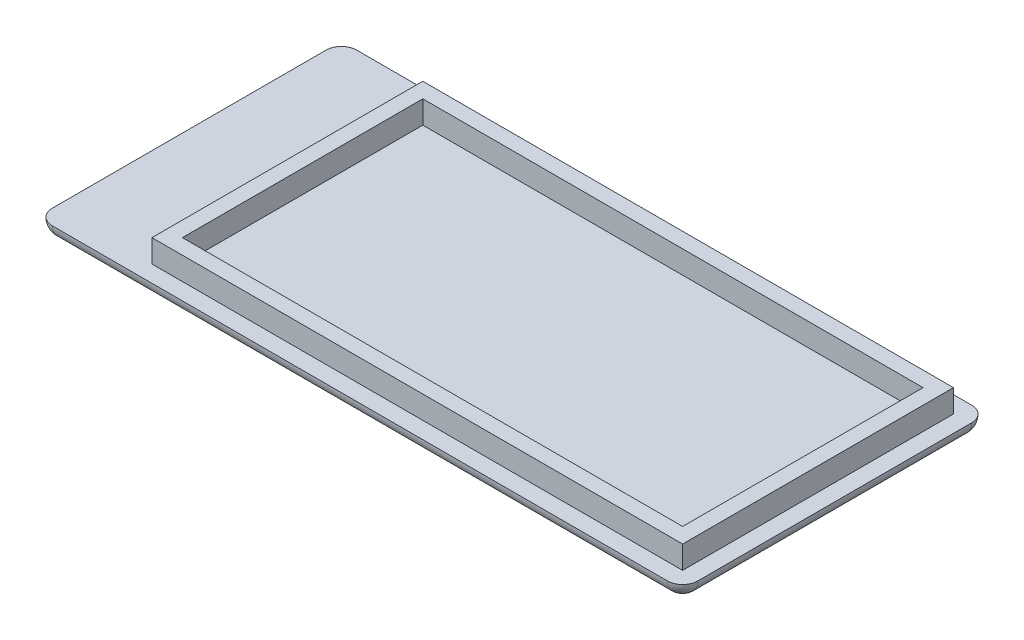
ISO-10303-21;
HEADER;
FILE_DESCRIPTION(('STEP AP214'),'2;1');
FILE_NAME('part.step','',(''),(''),'','','');
FILE_SCHEMA(('AUTOMOTIVE_DESIGN { 1 0 10303 214 1 1 1 1 }'));
ENDSEC;
DATA;
#1=APPLICATION_CONTEXT('core data for automotive mechanical design processes');
#2=APPLICATION_PROTOCOL_DEFINITION('international standard','automotive_design',2000,#1);
#3=PRODUCT_CONTEXT('',#1,'mechanical');
#4=PRODUCT('Part','Part','',(#3));
#5=PRODUCT_RELATED_PRODUCT_CATEGORY('part','',(#4));
#6=PRODUCT_DEFINITION_FORMATION('','',#4);
#7=PRODUCT_DEFINITION_CONTEXT('part definition',#1,'design');
#8=PRODUCT_DEFINITION('design','',#6,#7);
#9=PRODUCT_DEFINITION_SHAPE('','',#8);
#10=(LENGTH_UNIT() NAMED_UNIT(*) SI_UNIT(.MILLI.,.METRE.));
#11=(NAMED_UNIT(*) PLANE_ANGLE_UNIT() SI_UNIT($,.RADIAN.));
#12=(NAMED_UNIT(*) SI_UNIT($,.STERADIAN.) SOLID_ANGLE_UNIT());
#13=UNCERTAINTY_MEASURE_WITH_UNIT(LENGTH_MEASURE(1.E-05),#10,'distance_accuracy_value','');
#14=(GEOMETRIC_REPRESENTATION_CONTEXT(3) GLOBAL_UNCERTAINTY_ASSIGNED_CONTEXT((#13)) GLOBAL_UNIT_ASSIGNED_CONTEXT((#10,
#11,#12)) REPRESENTATION_CONTEXT('',''));
#15=CARTESIAN_POINT('',(0.,0.,0.));
#16=DIRECTION('',(0.,0.,1.));
#17=DIRECTION('',(1.,0.,0.));
#18=AXIS2_PLACEMENT_3D('',#15,#16,#17);
#19=CARTESIAN_POINT('',(0.,1.,19.99996));
#20=DIRECTION('',(0.,-1.,0.));
#21=DIRECTION('',(0.,0.,-1.));
#22=AXIS2_PLACEMENT_3D('',#19,#20,#21);
#23=PLANE('',#22);
#24=DIRECTION('',(-1.,0.,0.));
#25=VECTOR('',#24,1.);
#26=CARTESIAN_POINT('',(0.,1.,19.99996));
#27=LINE('',#26,#25);
#28=CARTESIAN_POINT('',(41.42562,1.,19.99996));
#29=VERTEX_POINT('',#28);
#30=CARTESIAN_POINT('',(1.,1.,19.99996));
#31=VERTEX_POINT('',#30);
#32=EDGE_CURVE('E205',#29,#31,#27,.T.);
#33=ORIENTED_EDGE('',*,*,#32,.F.);
#34=CARTESIAN_POINT('',(41.42562,1.,18.99996));
#35=DIRECTION('',(0.,-1.,0.));
#36=DIRECTION('',(0.,0.,-1.));
#37=AXIS2_PLACEMENT_3D('',#34,#35,#36);
#38=CIRCLE('',#37,1.);
#39=CARTESIAN_POINT('',(42.42562,1.,18.99996));
#40=VERTEX_POINT('',#39);
#41=EDGE_CURVE('E221',#29,#40,#38,.F.);
#42=ORIENTED_EDGE('',*,*,#41,.T.);
#43=DIRECTION('',(0.,0.,-1.));
#44=VECTOR('',#43,1.);
#45=CARTESIAN_POINT('',(42.42562,1.,19.99996));
#46=LINE('',#45,#44);
#47=CARTESIAN_POINT('',(42.42562,1.,1.));
#48=VERTEX_POINT('',#47);
#49=EDGE_CURVE('E213',#40,#48,#46,.T.);
#50=ORIENTED_EDGE('',*,*,#49,.T.);
#51=CARTESIAN_POINT('',(41.42562,1.,1.));
#52=DIRECTION('',(0.,-1.,0.));
#53=DIRECTION('',(0.,0.,-1.));
#54=AXIS2_PLACEMENT_3D('',#51,#52,#53);
#55=CIRCLE('',#54,1.);
#56=CARTESIAN_POINT('',(41.42562,1.,0.));
#57=VERTEX_POINT('',#56);
#58=EDGE_CURVE('E219',#48,#57,#55,.F.);
#59=ORIENTED_EDGE('',*,*,#58,.T.);
#60=DIRECTION('',(-1.,0.,0.));
#61=VECTOR('',#60,1.);
#62=CARTESIAN_POINT('',(0.,1.,0.));
#63=LINE('',#62,#61);
#64=CARTESIAN_POINT('',(1.,1.,0.));
#65=VERTEX_POINT('',#64);
#66=EDGE_CURVE('E209',#57,#65,#63,.T.);
#67=ORIENTED_EDGE('',*,*,#66,.T.);
#68=CARTESIAN_POINT('',(1.,1.,1.));
#69=DIRECTION('',(0.,-1.,0.));
#70=DIRECTION('',(0.,0.,-1.));
#71=AXIS2_PLACEMENT_3D('',#68,#69,#70);
#72=CIRCLE('',#71,1.);
#73=CARTESIAN_POINT('',(0.,1.,1.));
#74=VERTEX_POINT('',#73);
#75=EDGE_CURVE('E217',#65,#74,#72,.F.);
#76=ORIENTED_EDGE('',*,*,#75,.T.);
#77=DIRECTION('',(0.,0.,-1.));
#78=VECTOR('',#77,1.);
#79=CARTESIAN_POINT('',(0.,1.,19.99996));
#80=LINE('',#79,#78);
#81=CARTESIAN_POINT('',(0.,1.,18.99996));
#82=VERTEX_POINT('',#81);
#83=EDGE_CURVE('E208',#82,#74,#80,.T.);
#84=ORIENTED_EDGE('',*,*,#83,.F.);
#85=CARTESIAN_POINT('',(1.,1.,18.99996));
#86=DIRECTION('',(0.,-1.,0.));
#87=DIRECTION('',(0.,0.,-1.));
#88=AXIS2_PLACEMENT_3D('',#85,#86,#87);
#89=CIRCLE('',#88,1.);
#90=EDGE_CURVE('E215',#82,#31,#89,.F.);
#91=ORIENTED_EDGE('',*,*,#90,.T.);
#92=EDGE_LOOP('',(#33,#42,#50,#59,#67,#76,#84,#91));
#93=FACE_BOUND('',#92,.T.);
#94=DIRECTION('',(0.,0.,1.));
#95=VECTOR('',#94,1.);
#96=CARTESIAN_POINT('',(6.45142,1.,1.1));
#97=LINE('',#96,#95);
#98=CARTESIAN_POINT('',(6.45142,1.,1.1));
#99=VERTEX_POINT('',#98);
#100=CARTESIAN_POINT('',(6.45142,1.,18.89996));
#101=VERTEX_POINT('',#100);
#102=EDGE_CURVE('E153',#99,#101,#97,.T.);
#103=ORIENTED_EDGE('',*,*,#102,.F.);
#104=DIRECTION('',(-1.,0.,0.));
#105=VECTOR('',#104,1.);
#106=CARTESIAN_POINT('',(6.45142,1.,1.1));
#107=LINE('',#106,#105);
#108=CARTESIAN_POINT('',(41.32562,1.,1.1));
#109=VERTEX_POINT('',#108);
#110=EDGE_CURVE('E181',#109,#99,#107,.T.);
#111=ORIENTED_EDGE('',*,*,#110,.F.);
#112=DIRECTION('',(0.,0.,-1.));
#113=VECTOR('',#112,1.);
#114=CARTESIAN_POINT('',(41.32562,1.,1.1));
#115=LINE('',#114,#113);
#116=CARTESIAN_POINT('',(41.32562,1.,18.89996));
#117=VERTEX_POINT('',#116);
#118=EDGE_CURVE('E55',#117,#109,#115,.T.);
#119=ORIENTED_EDGE('',*,*,#118,.F.);
#120=DIRECTION('',(1.,0.,0.));
#121=VECTOR('',#120,1.);
#122=CARTESIAN_POINT('',(6.45142,1.,18.89996));
#123=LINE('',#122,#121);
#124=EDGE_CURVE('E50',#101,#117,#123,.T.);
#125=ORIENTED_EDGE('',*,*,#124,.F.);
#126=EDGE_LOOP('',(#103,#111,#119,#125));
#127=FACE_BOUND('',#126,.T.);
#128=ADVANCED_FACE('F33',(#93,#127),#23,.F.);
#129=CARTESIAN_POINT('',(0.,0.,19.99996));
#130=DIRECTION('',(0.,1.,0.));
#131=DIRECTION('',(0.,0.,1.));
#132=AXIS2_PLACEMENT_3D('',#129,#130,#131);
#133=PLANE('',#132);
#134=DIRECTION('',(1.,0.,0.));
#135=VECTOR('',#134,1.);
#136=CARTESIAN_POINT('',(42.42562,0.,1.));
#137=LINE('',#136,#135);
#138=CARTESIAN_POINT('',(1.,0.,1.));
#139=VERTEX_POINT('',#138);
#140=CARTESIAN_POINT('',(41.42562,0.,1.));
#141=VERTEX_POINT('',#140);
#142=EDGE_CURVE('E42',#139,#141,#137,.T.);
#143=ORIENTED_EDGE('',*,*,#142,.T.);
#144=DIRECTION('',(0.,0.,-1.));
#145=VECTOR('',#144,1.);
#146=CARTESIAN_POINT('',(41.42562,0.,19.99996));
#147=LINE('',#146,#145);
#148=CARTESIAN_POINT('',(41.42562,0.,18.99996));
#149=VERTEX_POINT('',#148);
#150=EDGE_CURVE('E11',#141,#149,#147,.F.);
#151=ORIENTED_EDGE('',*,*,#150,.T.);
#152=DIRECTION('',(1.,0.,0.));
#153=VECTOR('',#152,1.);
#154=CARTESIAN_POINT('',(0.,0.,18.99996));
#155=LINE('',#154,#153);
#156=CARTESIAN_POINT('',(1.,0.,18.99996));
#157=VERTEX_POINT('',#156);
#158=EDGE_CURVE('E224',#149,#157,#155,.F.);
#159=ORIENTED_EDGE('',*,*,#158,.T.);
#160=DIRECTION('',(0.,0.,-1.));
#161=VECTOR('',#160,1.);
#162=CARTESIAN_POINT('',(1.,0.,19.99996));
#163=LINE('',#162,#161);
#164=EDGE_CURVE('E226',#157,#139,#163,.T.);
#165=ORIENTED_EDGE('',*,*,#164,.T.);
#166=EDGE_LOOP('',(#143,#151,#159,#165));
#167=FACE_BOUND('',#166,.T.);
#168=ADVANCED_FACE('F270',(#167),#133,.F.);
#169=CARTESIAN_POINT('',(1.,1.,1.));
#170=DIRECTION('',(0.,0.,1.));
#171=DIRECTION('',(1.,0.,0.));
#172=AXIS2_PLACEMENT_3D('',#169,#170,#171);
#173=SPHERICAL_SURFACE('',#172,1.);
#174=CARTESIAN_POINT('',(1.,1.,1.));
#175=DIRECTION('',(0.,0.,-1.));
#176=DIRECTION('',(-1.,0.,0.));
#177=AXIS2_PLACEMENT_3D('',#174,#175,#176);
#178=CIRCLE('',#177,1.);
#179=EDGE_CURVE('E243',#74,#139,#178,.F.);
#180=ORIENTED_EDGE('',*,*,#179,.F.);
#181=ORIENTED_EDGE('',*,*,#75,.F.);
#182=CARTESIAN_POINT('',(1.,1.,1.));
#183=DIRECTION('',(-1.,0.,0.));
#184=DIRECTION('',(0.,0.,1.));
#185=AXIS2_PLACEMENT_3D('',#182,#183,#184);
#186=CIRCLE('',#185,1.);
#187=EDGE_CURVE('E37',#139,#65,#186,.F.);
#188=ORIENTED_EDGE('',*,*,#187,.F.);
#189=EDGE_LOOP('',(#180,#181,#188));
#190=FACE_BOUND('',#189,.T.);
#191=ADVANCED_FACE('F35',(#190),#173,.T.);
#192=CARTESIAN_POINT('',(0.,1.,1.));
#193=DIRECTION('',(-1.,0.,0.));
#194=DIRECTION('',(0.,0.,1.));
#195=AXIS2_PLACEMENT_3D('',#192,#193,#194);
#196=CYLINDRICAL_SURFACE('',#195,1.);
#197=ORIENTED_EDGE('',*,*,#187,.T.);
#198=ORIENTED_EDGE('',*,*,#66,.F.);
#199=CARTESIAN_POINT('',(41.42562,1.,1.));
#200=DIRECTION('',(1.,0.,0.));
#201=DIRECTION('',(0.,0.,-1.));
#202=AXIS2_PLACEMENT_3D('',#199,#200,#201);
#203=CIRCLE('',#202,1.);
#204=EDGE_CURVE('E241',#141,#57,#203,.T.);
#205=ORIENTED_EDGE('',*,*,#204,.F.);
#206=ORIENTED_EDGE('',*,*,#142,.F.);
#207=EDGE_LOOP('',(#197,#198,#205,#206));
#208=FACE_BOUND('',#207,.T.);
#209=ADVANCED_FACE('F253',(#208),#196,.T.);
#210=CARTESIAN_POINT('',(1.,1.,19.99996));
#211=DIRECTION('',(0.,0.,-1.));
#212=DIRECTION('',(-1.,0.,0.));
#213=AXIS2_PLACEMENT_3D('',#210,#211,#212);
#214=CYLINDRICAL_SURFACE('',#213,1.);
#215=ORIENTED_EDGE('',*,*,#179,.T.);
#216=ORIENTED_EDGE('',*,*,#164,.F.);
#217=CARTESIAN_POINT('',(1.,1.,18.99996));
#218=DIRECTION('',(0.,0.,1.));
#219=DIRECTION('',(1.,0.,0.));
#220=AXIS2_PLACEMENT_3D('',#217,#218,#219);
#221=CIRCLE('',#220,1.);
#222=EDGE_CURVE('E238',#82,#157,#221,.T.);
#223=ORIENTED_EDGE('',*,*,#222,.F.);
#224=ORIENTED_EDGE('',*,*,#83,.T.);
#225=EDGE_LOOP('',(#215,#216,#223,#224));
#226=FACE_BOUND('',#225,.T.);
#227=ADVANCED_FACE('F271',(#226),#214,.T.);
#228=CARTESIAN_POINT('',(41.42562,1.,1.));
#229=DIRECTION('',(0.,0.,1.));
#230=DIRECTION('',(1.,0.,0.));
#231=AXIS2_PLACEMENT_3D('',#228,#229,#230);
#232=SPHERICAL_SURFACE('',#231,1.);
#233=ORIENTED_EDGE('',*,*,#204,.T.);
#234=ORIENTED_EDGE('',*,*,#58,.F.);
#235=CARTESIAN_POINT('',(41.42562,1.,1.));
#236=DIRECTION('',(0.,0.,-1.));
#237=DIRECTION('',(-1.,0.,0.));
#238=AXIS2_PLACEMENT_3D('',#235,#236,#237);
#239=CIRCLE('',#238,1.);
#240=EDGE_CURVE('E235',#141,#48,#239,.F.);
#241=ORIENTED_EDGE('',*,*,#240,.F.);
#242=EDGE_LOOP('',(#233,#234,#241));
#243=FACE_BOUND('',#242,.T.);
#244=ADVANCED_FACE('F263',(#243),#232,.T.);
#245=CARTESIAN_POINT('',(1.,1.,18.99996));
#246=DIRECTION('',(0.,0.,1.));
#247=DIRECTION('',(1.,0.,0.));
#248=AXIS2_PLACEMENT_3D('',#245,#246,#247);
#249=SPHERICAL_SURFACE('',#248,1.);
#250=ORIENTED_EDGE('',*,*,#90,.F.);
#251=ORIENTED_EDGE('',*,*,#222,.T.);
#252=CARTESIAN_POINT('',(1.,1.,18.99996));
#253=DIRECTION('',(-1.,0.,0.));
#254=DIRECTION('',(0.,0.,1.));
#255=AXIS2_PLACEMENT_3D('',#252,#253,#254);
#256=CIRCLE('',#255,1.);
#257=EDGE_CURVE('E232',#31,#157,#256,.F.);
#258=ORIENTED_EDGE('',*,*,#257,.F.);
#259=EDGE_LOOP('',(#250,#251,#258));
#260=FACE_BOUND('',#259,.T.);
#261=ADVANCED_FACE('F275',(#260),#249,.T.);
#262=CARTESIAN_POINT('',(41.42562,1.,19.99996));
#263=DIRECTION('',(0.,0.,-1.));
#264=DIRECTION('',(-1.,0.,0.));
#265=AXIS2_PLACEMENT_3D('',#262,#263,#264);
#266=CYLINDRICAL_SURFACE('',#265,1.);
#267=ORIENTED_EDGE('',*,*,#240,.T.);
#268=ORIENTED_EDGE('',*,*,#49,.F.);
#269=CARTESIAN_POINT('',(41.42562,1.,18.99996));
#270=DIRECTION('',(0.,0.,1.));
#271=DIRECTION('',(1.,0.,0.));
#272=AXIS2_PLACEMENT_3D('',#269,#270,#271);
#273=CIRCLE('',#272,1.);
#274=EDGE_CURVE('E230',#149,#40,#273,.T.);
#275=ORIENTED_EDGE('',*,*,#274,.F.);
#276=ORIENTED_EDGE('',*,*,#150,.F.);
#277=EDGE_LOOP('',(#267,#268,#275,#276));
#278=FACE_BOUND('',#277,.T.);
#279=ADVANCED_FACE('F266',(#278),#266,.T.);
#280=CARTESIAN_POINT('',(0.,1.,18.99996));
#281=DIRECTION('',(1.,0.,0.));
#282=DIRECTION('',(0.,0.,-1.));
#283=AXIS2_PLACEMENT_3D('',#280,#281,#282);
#284=CYLINDRICAL_SURFACE('',#283,1.);
#285=ORIENTED_EDGE('',*,*,#257,.T.);
#286=ORIENTED_EDGE('',*,*,#158,.F.);
#287=CARTESIAN_POINT('',(41.42562,1.,18.99996));
#288=DIRECTION('',(1.,0.,0.));
#289=DIRECTION('',(0.,0.,-1.));
#290=AXIS2_PLACEMENT_3D('',#287,#288,#289);
#291=CIRCLE('',#290,1.);
#292=EDGE_CURVE('E204',#29,#149,#291,.T.);
#293=ORIENTED_EDGE('',*,*,#292,.F.);
#294=ORIENTED_EDGE('',*,*,#32,.T.);
#295=EDGE_LOOP('',(#285,#286,#293,#294));
#296=FACE_BOUND('',#295,.T.);
#297=ADVANCED_FACE('F277',(#296),#284,.T.);
#298=CARTESIAN_POINT('',(41.42562,1.,18.99996));
#299=DIRECTION('',(0.,0.,1.));
#300=DIRECTION('',(1.,0.,0.));
#301=AXIS2_PLACEMENT_3D('',#298,#299,#300);
#302=SPHERICAL_SURFACE('',#301,1.);
#303=ORIENTED_EDGE('',*,*,#41,.F.);
#304=ORIENTED_EDGE('',*,*,#292,.T.);
#305=ORIENTED_EDGE('',*,*,#274,.T.);
#306=EDGE_LOOP('',(#303,#304,#305));
#307=FACE_BOUND('',#306,.T.);
#308=ADVANCED_FACE('F281',(#307),#302,.T.);
#309=CARTESIAN_POINT('',(0.,2.5,0.));
#310=DIRECTION('',(0.,1.,0.));
#311=DIRECTION('',(0.,0.,1.));
#312=AXIS2_PLACEMENT_3D('',#309,#310,#311);
#313=PLANE('',#312);
#314=DIRECTION('',(0.,0.,1.));
#315=VECTOR('',#314,1.);
#316=CARTESIAN_POINT('',(6.45142,2.5,1.1));
#317=LINE('',#316,#315);
#318=CARTESIAN_POINT('',(6.45142,2.5,1.1));
#319=VERTEX_POINT('',#318);
#320=CARTESIAN_POINT('',(6.45142,2.5,18.89996));
#321=VERTEX_POINT('',#320);
#322=EDGE_CURVE('E177',#319,#321,#317,.T.);
#323=ORIENTED_EDGE('',*,*,#322,.T.);
#324=DIRECTION('',(1.,0.,0.));
#325=VECTOR('',#324,1.);
#326=CARTESIAN_POINT('',(6.45142,2.5,18.89996));
#327=LINE('',#326,#325);
#328=CARTESIAN_POINT('',(41.32562,2.5,18.89996));
#329=VERTEX_POINT('',#328);
#330=EDGE_CURVE('E180',#321,#329,#327,.T.);
#331=ORIENTED_EDGE('',*,*,#330,.T.);
#332=DIRECTION('',(0.,0.,-1.));
#333=VECTOR('',#332,1.);
#334=CARTESIAN_POINT('',(41.32562,2.5,1.1));
#335=LINE('',#334,#333);
#336=CARTESIAN_POINT('',(41.32562,2.5,1.1));
#337=VERTEX_POINT('',#336);
#338=EDGE_CURVE('E183',#329,#337,#335,.T.);
#339=ORIENTED_EDGE('',*,*,#338,.T.);
#340=DIRECTION('',(-1.,0.,0.));
#341=VECTOR('',#340,1.);
#342=CARTESIAN_POINT('',(6.45142,2.5,1.1));
#343=LINE('',#342,#341);
#344=EDGE_CURVE('E185',#337,#319,#343,.T.);
#345=ORIENTED_EDGE('',*,*,#344,.T.);
#346=EDGE_LOOP('',(#323,#331,#339,#345));
#347=FACE_BOUND('',#346,.T.);
#348=DIRECTION('',(0.,0.,1.));
#349=VECTOR('',#348,1.);
#350=CARTESIAN_POINT('',(7.45142,2.5,2.1));
#351=LINE('',#350,#349);
#352=CARTESIAN_POINT('',(7.45142,2.5,2.1));
#353=VERTEX_POINT('',#352);
#354=CARTESIAN_POINT('',(7.45142,2.5,17.89996));
#355=VERTEX_POINT('',#354);
#356=EDGE_CURVE('E145',#353,#355,#351,.T.);
#357=ORIENTED_EDGE('',*,*,#356,.F.);
#358=DIRECTION('',(-1.,0.,0.));
#359=VECTOR('',#358,1.);
#360=CARTESIAN_POINT('',(7.45142,2.5,2.1));
#361=LINE('',#360,#359);
#362=CARTESIAN_POINT('',(40.32562,2.5,2.1));
#363=VERTEX_POINT('',#362);
#364=EDGE_CURVE('E135',#363,#353,#361,.T.);
#365=ORIENTED_EDGE('',*,*,#364,.F.);
#366=DIRECTION('',(0.,0.,-1.));
#367=VECTOR('',#366,1.);
#368=CARTESIAN_POINT('',(40.32562,2.5,2.1));
#369=LINE('',#368,#367);
#370=CARTESIAN_POINT('',(40.32562,2.5,17.89996));
#371=VERTEX_POINT('',#370);
#372=EDGE_CURVE('E161',#371,#363,#369,.T.);
#373=ORIENTED_EDGE('',*,*,#372,.F.);
#374=DIRECTION('',(1.,0.,0.));
#375=VECTOR('',#374,1.);
#376=CARTESIAN_POINT('',(7.45142,2.5,17.89996));
#377=LINE('',#376,#375);
#378=EDGE_CURVE('E159',#355,#371,#377,.T.);
#379=ORIENTED_EDGE('',*,*,#378,.F.);
#380=EDGE_LOOP('',(#357,#365,#373,#379));
#381=FACE_BOUND('',#380,.T.);
#382=ADVANCED_FACE('F157',(#347,#381),#313,.T.);
#383=CARTESIAN_POINT('',(6.45142,2.5,1.1));
#384=DIRECTION('',(1.,0.,0.));
#385=DIRECTION('',(0.,0.,-1.));
#386=AXIS2_PLACEMENT_3D('',#383,#384,#385);
#387=PLANE('',#386);
#388=ORIENTED_EDGE('',*,*,#102,.T.);
#389=DIRECTION('',(0.,-1.,0.));
#390=VECTOR('',#389,1.);
#391=CARTESIAN_POINT('',(6.45142,2.5,18.89996));
#392=LINE('',#391,#390);
#393=EDGE_CURVE('E202',#321,#101,#392,.T.);
#394=ORIENTED_EDGE('',*,*,#393,.F.);
#395=ORIENTED_EDGE('',*,*,#322,.F.);
#396=DIRECTION('',(0.,-1.,0.));
#397=VECTOR('',#396,1.);
#398=CARTESIAN_POINT('',(6.45142,2.5,1.1));
#399=LINE('',#398,#397);
#400=EDGE_CURVE('E187',#319,#99,#399,.T.);
#401=ORIENTED_EDGE('',*,*,#400,.T.);
#402=EDGE_LOOP('',(#388,#394,#395,#401));
#403=FACE_BOUND('',#402,.T.);
#404=ADVANCED_FACE('F288',(#403),#387,.F.);
#405=CARTESIAN_POINT('',(6.45142,2.5,18.89996));
#406=DIRECTION('',(0.,0.,-1.));
#407=DIRECTION('',(-1.,0.,0.));
#408=AXIS2_PLACEMENT_3D('',#405,#406,#407);
#409=PLANE('',#408);
#410=ORIENTED_EDGE('',*,*,#124,.T.);
#411=DIRECTION('',(0.,-1.,0.));
#412=VECTOR('',#411,1.);
#413=CARTESIAN_POINT('',(41.32562,2.5,18.89996));
#414=LINE('',#413,#412);
#415=EDGE_CURVE('E199',#329,#117,#414,.T.);
#416=ORIENTED_EDGE('',*,*,#415,.F.);
#417=ORIENTED_EDGE('',*,*,#330,.F.);
#418=ORIENTED_EDGE('',*,*,#393,.T.);
#419=EDGE_LOOP('',(#410,#416,#417,#418));
#420=FACE_BOUND('',#419,.T.);
#421=ADVANCED_FACE('F328',(#420),#409,.F.);
#422=CARTESIAN_POINT('',(41.32562,2.5,1.1));
#423=DIRECTION('',(-1.,0.,0.));
#424=DIRECTION('',(0.,0.,1.));
#425=AXIS2_PLACEMENT_3D('',#422,#423,#424);
#426=PLANE('',#425);
#427=ORIENTED_EDGE('',*,*,#118,.T.);
#428=DIRECTION('',(0.,-1.,0.));
#429=VECTOR('',#428,1.);
#430=CARTESIAN_POINT('',(41.32562,2.5,1.1));
#431=LINE('',#430,#429);
#432=EDGE_CURVE('E196',#337,#109,#431,.T.);
#433=ORIENTED_EDGE('',*,*,#432,.F.);
#434=ORIENTED_EDGE('',*,*,#338,.F.);
#435=ORIENTED_EDGE('',*,*,#415,.T.);
#436=EDGE_LOOP('',(#427,#433,#434,#435));
#437=FACE_BOUND('',#436,.T.);
#438=ADVANCED_FACE('F324',(#437),#426,.F.);
#439=CARTESIAN_POINT('',(6.45142,2.5,1.1));
#440=DIRECTION('',(0.,0.,1.));
#441=DIRECTION('',(1.,0.,0.));
#442=AXIS2_PLACEMENT_3D('',#439,#440,#441);
#443=PLANE('',#442);
#444=ORIENTED_EDGE('',*,*,#110,.T.);
#445=ORIENTED_EDGE('',*,*,#400,.F.);
#446=ORIENTED_EDGE('',*,*,#344,.F.);
#447=ORIENTED_EDGE('',*,*,#432,.T.);
#448=EDGE_LOOP('',(#444,#445,#446,#447));
#449=FACE_BOUND('',#448,.T.);
#450=ADVANCED_FACE('F320',(#449),#443,.F.);
#451=CARTESIAN_POINT('',(7.45142,2.5,2.1));
#452=DIRECTION('',(0.,0.,1.));
#453=DIRECTION('',(1.,0.,0.));
#454=AXIS2_PLACEMENT_3D('',#451,#452,#453);
#455=PLANE('',#454);
#456=DIRECTION('',(-1.,0.,0.));
#457=VECTOR('',#456,1.);
#458=CARTESIAN_POINT('',(7.45142,1.,2.1));
#459=LINE('',#458,#457);
#460=CARTESIAN_POINT('',(40.32562,1.,2.1));
#461=VERTEX_POINT('',#460);
#462=CARTESIAN_POINT('',(7.45142,1.,2.1));
#463=VERTEX_POINT('',#462);
#464=EDGE_CURVE('E165',#461,#463,#459,.T.);
#465=ORIENTED_EDGE('',*,*,#464,.F.);
#466=DIRECTION('',(0.,-1.,0.));
#467=VECTOR('',#466,1.);
#468=CARTESIAN_POINT('',(40.32562,2.5,2.1));
#469=LINE('',#468,#467);
#470=EDGE_CURVE('E141',#363,#461,#469,.T.);
#471=ORIENTED_EDGE('',*,*,#470,.F.);
#472=ORIENTED_EDGE('',*,*,#364,.T.);
#473=DIRECTION('',(0.,-1.,0.));
#474=VECTOR('',#473,1.);
#475=CARTESIAN_POINT('',(7.45142,2.5,2.1));
#476=LINE('',#475,#474);
#477=EDGE_CURVE('E139',#353,#463,#476,.T.);
#478=ORIENTED_EDGE('',*,*,#477,.T.);
#479=EDGE_LOOP('',(#465,#471,#472,#478));
#480=FACE_BOUND('',#479,.T.);
#481=ADVANCED_FACE('F138',(#480),#455,.T.);
#482=CARTESIAN_POINT('',(7.45142,2.5,2.1));
#483=DIRECTION('',(1.,0.,0.));
#484=DIRECTION('',(0.,0.,-1.));
#485=AXIS2_PLACEMENT_3D('',#482,#483,#484);
#486=PLANE('',#485);
#487=DIRECTION('',(0.,0.,1.));
#488=VECTOR('',#487,1.);
#489=CARTESIAN_POINT('',(7.45142,1.,2.1));
#490=LINE('',#489,#488);
#491=CARTESIAN_POINT('',(7.45142,1.,17.89996));
#492=VERTEX_POINT('',#491);
#493=EDGE_CURVE('E152',#463,#492,#490,.T.);
#494=ORIENTED_EDGE('',*,*,#493,.F.);
#495=ORIENTED_EDGE('',*,*,#477,.F.);
#496=ORIENTED_EDGE('',*,*,#356,.T.);
#497=DIRECTION('',(0.,-1.,0.));
#498=VECTOR('',#497,1.);
#499=CARTESIAN_POINT('',(7.45142,2.5,17.89996));
#500=LINE('',#499,#498);
#501=EDGE_CURVE('E154',#355,#492,#500,.T.);
#502=ORIENTED_EDGE('',*,*,#501,.T.);
#503=EDGE_LOOP('',(#494,#495,#496,#502));
#504=FACE_BOUND('',#503,.T.);
#505=ADVANCED_FACE('F149',(#504),#486,.T.);
#506=CARTESIAN_POINT('',(7.45142,2.5,17.89996));
#507=DIRECTION('',(0.,0.,-1.));
#508=DIRECTION('',(-1.,0.,0.));
#509=AXIS2_PLACEMENT_3D('',#506,#507,#508);
#510=PLANE('',#509);
#511=DIRECTION('',(1.,0.,0.));
#512=VECTOR('',#511,1.);
#513=CARTESIAN_POINT('',(7.45142,1.,17.89996));
#514=LINE('',#513,#512);
#515=CARTESIAN_POINT('',(40.32562,1.,17.89996));
#516=VERTEX_POINT('',#515);
#517=EDGE_CURVE('E168',#492,#516,#514,.T.);
#518=ORIENTED_EDGE('',*,*,#517,.F.);
#519=ORIENTED_EDGE('',*,*,#501,.F.);
#520=ORIENTED_EDGE('',*,*,#378,.T.);
#521=DIRECTION('',(0.,-1.,0.));
#522=VECTOR('',#521,1.);
#523=CARTESIAN_POINT('',(40.32562,2.5,17.89996));
#524=LINE('',#523,#522);
#525=EDGE_CURVE('E174',#371,#516,#524,.T.);
#526=ORIENTED_EDGE('',*,*,#525,.T.);
#527=EDGE_LOOP('',(#518,#519,#520,#526));
#528=FACE_BOUND('',#527,.T.);
#529=ADVANCED_FACE('F306',(#528),#510,.T.);
#530=CARTESIAN_POINT('',(40.32562,2.5,2.1));
#531=DIRECTION('',(-1.,0.,0.));
#532=DIRECTION('',(0.,0.,1.));
#533=AXIS2_PLACEMENT_3D('',#530,#531,#532);
#534=PLANE('',#533);
#535=DIRECTION('',(0.,0.,-1.));
#536=VECTOR('',#535,1.);
#537=CARTESIAN_POINT('',(40.32562,1.,2.1));
#538=LINE('',#537,#536);
#539=EDGE_CURVE('E146',#516,#461,#538,.T.);
#540=ORIENTED_EDGE('',*,*,#539,.F.);
#541=ORIENTED_EDGE('',*,*,#525,.F.);
#542=ORIENTED_EDGE('',*,*,#372,.T.);
#543=ORIENTED_EDGE('',*,*,#470,.T.);
#544=EDGE_LOOP('',(#540,#541,#542,#543));
#545=FACE_BOUND('',#544,.T.);
#546=ADVANCED_FACE('F301',(#545),#534,.T.);
#547=ORIENTED_EDGE('',*,*,#539,.T.);
#548=ORIENTED_EDGE('',*,*,#464,.T.);
#549=ORIENTED_EDGE('',*,*,#493,.T.);
#550=ORIENTED_EDGE('',*,*,#517,.T.);
#551=EDGE_LOOP('',(#547,#548,#549,#550));
#552=FACE_BOUND('',#551,.T.);
#553=ADVANCED_FACE('F295',(#552),#23,.F.);
#554=CLOSED_SHELL('',(#128,#168,#191,#209,#227,#244,#261,#279,#297,#308,#382,#404,#421,#438,
#450,#481,#505,#529,#546,#553));
#555=MANIFOLD_SOLID_BREP('B2',#554);
#556=ADVANCED_BREP_SHAPE_REPRESENTATION('',(#18,#555),#14);
#557=SHAPE_DEFINITION_REPRESENTATION(#9,#556);
ENDSEC;
END-ISO-10303-21;
